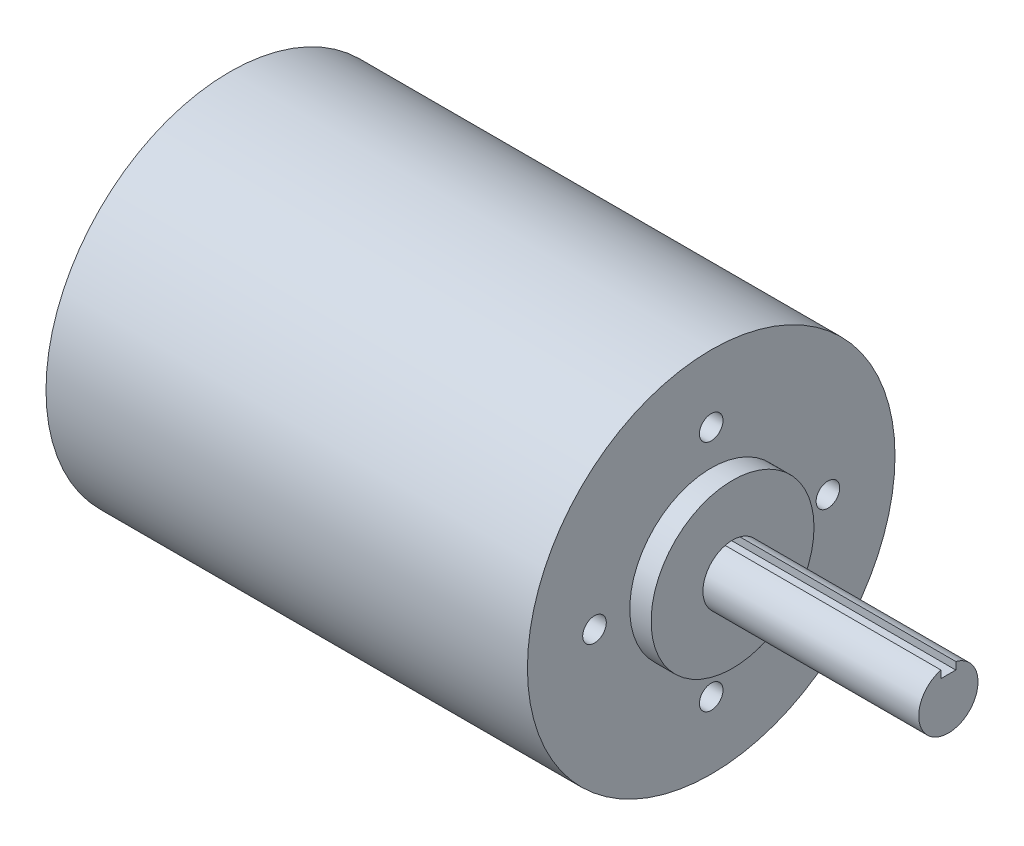
ISO-10303-21;
HEADER;
FILE_DESCRIPTION(('STEP AP214'),'2;1');
FILE_NAME('part.step','',(''),(''),'','','');
FILE_SCHEMA(('AUTOMOTIVE_DESIGN { 1 0 10303 214 1 1 1 1 }'));
ENDSEC;
DATA;
#1=APPLICATION_CONTEXT('core data for automotive mechanical design processes');
#2=APPLICATION_PROTOCOL_DEFINITION('international standard','automotive_design',2000,#1);
#3=PRODUCT_CONTEXT('',#1,'mechanical');
#4=PRODUCT('Part','Part','',(#3));
#5=PRODUCT_RELATED_PRODUCT_CATEGORY('part','',(#4));
#6=PRODUCT_DEFINITION_FORMATION('','',#4);
#7=PRODUCT_DEFINITION_CONTEXT('part definition',#1,'design');
#8=PRODUCT_DEFINITION('design','',#6,#7);
#9=PRODUCT_DEFINITION_SHAPE('','',#8);
#10=(LENGTH_UNIT() NAMED_UNIT(*) SI_UNIT(.MILLI.,.METRE.));
#11=(NAMED_UNIT(*) PLANE_ANGLE_UNIT() SI_UNIT($,.RADIAN.));
#12=(NAMED_UNIT(*) SI_UNIT($,.STERADIAN.) SOLID_ANGLE_UNIT());
#13=UNCERTAINTY_MEASURE_WITH_UNIT(LENGTH_MEASURE(1.E-05),#10,'distance_accuracy_value','');
#14=(GEOMETRIC_REPRESENTATION_CONTEXT(3) GLOBAL_UNCERTAINTY_ASSIGNED_CONTEXT((#13)) GLOBAL_UNIT_ASSIGNED_CONTEXT((#10,
#11,#12)) REPRESENTATION_CONTEXT('',''));
#15=CARTESIAN_POINT('',(0.,0.,0.));
#16=DIRECTION('',(0.,0.,1.));
#17=DIRECTION('',(1.,0.,0.));
#18=AXIS2_PLACEMENT_3D('',#15,#16,#17);
#19=CARTESIAN_POINT('',(103.124,0.,0.));
#20=DIRECTION('',(1.,0.,0.));
#21=DIRECTION('',(0.,0.,-1.));
#22=AXIS2_PLACEMENT_3D('',#19,#20,#21);
#23=PLANE('',#22);
#24=CARTESIAN_POINT('',(103.124,2.61861100413235E-13,25.));
#25=DIRECTION('',(1.,0.,0.));
#26=DIRECTION('',(0.,0.,-1.));
#27=AXIS2_PLACEMENT_3D('',#24,#25,#26);
#28=CIRCLE('',#27,2.5273);
#29=CARTESIAN_POINT('',(103.124,2.61861100413235E-13,22.4727));
#30=VERTEX_POINT('',#29);
#31=EDGE_CURVE('E335',#30,#30,#28,.T.);
#32=ORIENTED_EDGE('',*,*,#31,.F.);
#33=EDGE_LOOP('',(#32));
#34=FACE_BOUND('',#33,.T.);
#35=CARTESIAN_POINT('',(103.124,-25.,0.));
#36=DIRECTION('',(1.,0.,0.));
#37=DIRECTION('',(0.,0.,-1.));
#38=AXIS2_PLACEMENT_3D('',#35,#36,#37);
#39=CIRCLE('',#38,2.5273);
#40=CARTESIAN_POINT('',(103.124,-25.,-2.5273));
#41=VERTEX_POINT('',#40);
#42=EDGE_CURVE('E341',#41,#41,#39,.T.);
#43=ORIENTED_EDGE('',*,*,#42,.F.);
#44=EDGE_LOOP('',(#43));
#45=FACE_BOUND('',#44,.T.);
#46=CARTESIAN_POINT('',(103.124,0.,-25.));
#47=DIRECTION('',(1.,0.,0.));
#48=DIRECTION('',(0.,0.,-1.));
#49=AXIS2_PLACEMENT_3D('',#46,#47,#48);
#50=CIRCLE('',#49,2.5273);
#51=CARTESIAN_POINT('',(103.124,0.,-27.5273));
#52=VERTEX_POINT('',#51);
#53=EDGE_CURVE('E347',#52,#52,#50,.T.);
#54=ORIENTED_EDGE('',*,*,#53,.F.);
#55=EDGE_LOOP('',(#54));
#56=FACE_BOUND('',#55,.T.);
#57=CARTESIAN_POINT('',(103.124,25.,0.));
#58=DIRECTION('',(1.,0.,0.));
#59=DIRECTION('',(0.,0.,-1.));
#60=AXIS2_PLACEMENT_3D('',#57,#58,#59);
#61=CIRCLE('',#60,2.5273);
#62=CARTESIAN_POINT('',(103.124,25.,-2.5273));
#63=VERTEX_POINT('',#62);
#64=EDGE_CURVE('E353',#63,#63,#61,.T.);
#65=ORIENTED_EDGE('',*,*,#64,.F.);
#66=EDGE_LOOP('',(#65));
#67=FACE_BOUND('',#66,.T.);
#68=CARTESIAN_POINT('',(103.124,0.,0.));
#69=DIRECTION('',(1.,0.,0.));
#70=DIRECTION('',(0.,0.,-1.));
#71=AXIS2_PLACEMENT_3D('',#68,#69,#70);
#72=CIRCLE('',#71,39.37);
#73=CARTESIAN_POINT('',(103.124,0.,-39.37));
#74=VERTEX_POINT('',#73);
#75=EDGE_CURVE('E11',#74,#74,#72,.T.);
#76=ORIENTED_EDGE('',*,*,#75,.T.);
#77=EDGE_LOOP('',(#76));
#78=FACE_BOUND('',#77,.T.);
#79=CARTESIAN_POINT('',(103.124,0.,0.));
#80=DIRECTION('',(1.,0.,0.));
#81=DIRECTION('',(0.,0.,-1.));
#82=AXIS2_PLACEMENT_3D('',#79,#80,#81);
#83=CIRCLE('',#82,17.4498);
#84=CARTESIAN_POINT('',(103.124,0.,-17.4498));
#85=VERTEX_POINT('',#84);
#86=EDGE_CURVE('E327',#85,#85,#83,.T.);
#87=ORIENTED_EDGE('',*,*,#86,.F.);
#88=EDGE_LOOP('',(#87));
#89=FACE_BOUND('',#88,.T.);
#90=ADVANCED_FACE('F35',(#34,#45,#56,#67,#78,#89),#23,.T.);
#91=CARTESIAN_POINT('',(103.124,0.,0.));
#92=DIRECTION('',(-1.,0.,0.));
#93=DIRECTION('',(0.,0.,1.));
#94=AXIS2_PLACEMENT_3D('',#91,#92,#93);
#95=CYLINDRICAL_SURFACE('',#94,39.37);
#96=ORIENTED_EDGE('',*,*,#75,.F.);
#97=EDGE_LOOP('',(#96));
#98=FACE_BOUND('',#97,.T.);
#99=CARTESIAN_POINT('',(0.,0.,0.));
#100=DIRECTION('',(1.,0.,0.));
#101=DIRECTION('',(0.,0.,-1.));
#102=AXIS2_PLACEMENT_3D('',#99,#100,#101);
#103=CIRCLE('',#102,39.37);
#104=CARTESIAN_POINT('',(0.,0.,-39.37));
#105=VERTEX_POINT('',#104);
#106=EDGE_CURVE('E39',#105,#105,#103,.T.);
#107=ORIENTED_EDGE('',*,*,#106,.T.);
#108=EDGE_LOOP('',(#107));
#109=FACE_BOUND('',#108,.T.);
#110=ADVANCED_FACE('F37',(#98,#109),#95,.T.);
#111=CARTESIAN_POINT('',(0.,0.,0.));
#112=DIRECTION('',(1.,0.,0.));
#113=DIRECTION('',(0.,0.,-1.));
#114=AXIS2_PLACEMENT_3D('',#111,#112,#113);
#115=PLANE('',#114);
#116=ORIENTED_EDGE('',*,*,#106,.F.);
#117=EDGE_LOOP('',(#116));
#118=FACE_BOUND('',#117,.T.);
#119=ADVANCED_FACE('F135',(#118),#115,.F.);
#120=CARTESIAN_POINT('',(93.124,25.,0.));
#121=DIRECTION('',(1.,0.,0.));
#122=DIRECTION('',(0.,0.,-1.));
#123=AXIS2_PLACEMENT_3D('',#120,#121,#122);
#124=CONICAL_SURFACE('',#123,2.5273,1.02974425867665);
#125=CARTESIAN_POINT('',(91.6054449575316,25.,0.));
#126=VERTEX_POINT('',#125);
#127=VERTEX_LOOP('',#126);
#128=FACE_BOUND('',#127,.T.);
#129=CARTESIAN_POINT('',(93.124,25.,0.));
#130=DIRECTION('',(1.,0.,0.));
#131=DIRECTION('',(0.,0.,-1.));
#132=AXIS2_PLACEMENT_3D('',#129,#130,#131);
#133=CIRCLE('',#132,2.5273);
#134=CARTESIAN_POINT('',(93.124,25.,-2.5273));
#135=VERTEX_POINT('',#134);
#136=EDGE_CURVE('E356',#135,#135,#133,.T.);
#137=ORIENTED_EDGE('',*,*,#136,.T.);
#138=EDGE_LOOP('',(#137));
#139=FACE_BOUND('',#138,.T.);
#140=ADVANCED_FACE('F137',(#128,#139),#124,.F.);
#141=CARTESIAN_POINT('',(103.124,25.,0.));
#142=DIRECTION('',(1.,0.,0.));
#143=DIRECTION('',(0.,0.,-1.));
#144=AXIS2_PLACEMENT_3D('',#141,#142,#143);
#145=CYLINDRICAL_SURFACE('',#144,2.5273);
#146=ORIENTED_EDGE('',*,*,#136,.F.);
#147=EDGE_LOOP('',(#146));
#148=FACE_BOUND('',#147,.T.);
#149=ORIENTED_EDGE('',*,*,#64,.T.);
#150=EDGE_LOOP('',(#149));
#151=FACE_BOUND('',#150,.T.);
#152=ADVANCED_FACE('F142',(#148,#151),#145,.F.);
#153=CARTESIAN_POINT('',(93.124,0.,-25.));
#154=DIRECTION('',(1.,0.,0.));
#155=DIRECTION('',(0.,0.,-1.));
#156=AXIS2_PLACEMENT_3D('',#153,#154,#155);
#157=CONICAL_SURFACE('',#156,2.5273,1.02974425867665);
#158=CARTESIAN_POINT('',(91.6054449575316,0.,-25.));
#159=VERTEX_POINT('',#158);
#160=VERTEX_LOOP('',#159);
#161=FACE_BOUND('',#160,.T.);
#162=CARTESIAN_POINT('',(93.124,0.,-25.));
#163=DIRECTION('',(1.,0.,0.));
#164=DIRECTION('',(0.,0.,-1.));
#165=AXIS2_PLACEMENT_3D('',#162,#163,#164);
#166=CIRCLE('',#165,2.5273);
#167=CARTESIAN_POINT('',(93.124,0.,-27.5273));
#168=VERTEX_POINT('',#167);
#169=EDGE_CURVE('E350',#168,#168,#166,.T.);
#170=ORIENTED_EDGE('',*,*,#169,.T.);
#171=EDGE_LOOP('',(#170));
#172=FACE_BOUND('',#171,.T.);
#173=ADVANCED_FACE('F178',(#161,#172),#157,.F.);
#174=CARTESIAN_POINT('',(103.124,0.,-25.));
#175=DIRECTION('',(1.,0.,0.));
#176=DIRECTION('',(0.,0.,-1.));
#177=AXIS2_PLACEMENT_3D('',#174,#175,#176);
#178=CYLINDRICAL_SURFACE('',#177,2.5273);
#179=ORIENTED_EDGE('',*,*,#169,.F.);
#180=EDGE_LOOP('',(#179));
#181=FACE_BOUND('',#180,.T.);
#182=ORIENTED_EDGE('',*,*,#53,.T.);
#183=EDGE_LOOP('',(#182));
#184=FACE_BOUND('',#183,.T.);
#185=ADVANCED_FACE('F182',(#181,#184),#178,.F.);
#186=CARTESIAN_POINT('',(93.124,-25.,0.));
#187=DIRECTION('',(1.,0.,0.));
#188=DIRECTION('',(0.,0.,-1.));
#189=AXIS2_PLACEMENT_3D('',#186,#187,#188);
#190=CONICAL_SURFACE('',#189,2.5273,1.02974425867665);
#191=CARTESIAN_POINT('',(91.6054449575316,-25.,0.));
#192=VERTEX_POINT('',#191);
#193=VERTEX_LOOP('',#192);
#194=FACE_BOUND('',#193,.T.);
#195=CARTESIAN_POINT('',(93.124,-25.,0.));
#196=DIRECTION('',(1.,0.,0.));
#197=DIRECTION('',(0.,0.,-1.));
#198=AXIS2_PLACEMENT_3D('',#195,#196,#197);
#199=CIRCLE('',#198,2.5273);
#200=CARTESIAN_POINT('',(93.124,-25.,-2.5273));
#201=VERTEX_POINT('',#200);
#202=EDGE_CURVE('E344',#201,#201,#199,.T.);
#203=ORIENTED_EDGE('',*,*,#202,.T.);
#204=EDGE_LOOP('',(#203));
#205=FACE_BOUND('',#204,.T.);
#206=ADVANCED_FACE('F186',(#194,#205),#190,.F.);
#207=CARTESIAN_POINT('',(103.124,-25.,0.));
#208=DIRECTION('',(1.,0.,0.));
#209=DIRECTION('',(0.,0.,-1.));
#210=AXIS2_PLACEMENT_3D('',#207,#208,#209);
#211=CYLINDRICAL_SURFACE('',#210,2.5273);
#212=ORIENTED_EDGE('',*,*,#202,.F.);
#213=EDGE_LOOP('',(#212));
#214=FACE_BOUND('',#213,.T.);
#215=ORIENTED_EDGE('',*,*,#42,.T.);
#216=EDGE_LOOP('',(#215));
#217=FACE_BOUND('',#216,.T.);
#218=ADVANCED_FACE('F190',(#214,#217),#211,.F.);
#219=CARTESIAN_POINT('',(93.124,2.61861100413235E-13,25.));
#220=DIRECTION('',(1.,0.,0.));
#221=DIRECTION('',(0.,0.,-1.));
#222=AXIS2_PLACEMENT_3D('',#219,#220,#221);
#223=CONICAL_SURFACE('',#222,2.5273,1.02974425867665);
#224=CARTESIAN_POINT('',(91.6054449575316,2.5876526367141E-13,25.));
#225=VERTEX_POINT('',#224);
#226=VERTEX_LOOP('',#225);
#227=FACE_BOUND('',#226,.T.);
#228=CARTESIAN_POINT('',(93.124,2.61861100413235E-13,25.));
#229=DIRECTION('',(1.,0.,0.));
#230=DIRECTION('',(0.,0.,-1.));
#231=AXIS2_PLACEMENT_3D('',#228,#229,#230);
#232=CIRCLE('',#231,2.5273);
#233=CARTESIAN_POINT('',(93.124,2.61861100413235E-13,22.4727));
#234=VERTEX_POINT('',#233);
#235=EDGE_CURVE('E338',#234,#234,#232,.T.);
#236=ORIENTED_EDGE('',*,*,#235,.T.);
#237=EDGE_LOOP('',(#236));
#238=FACE_BOUND('',#237,.T.);
#239=ADVANCED_FACE('F194',(#227,#238),#223,.F.);
#240=CARTESIAN_POINT('',(103.124,2.61861100413235E-13,25.));
#241=DIRECTION('',(1.,0.,0.));
#242=DIRECTION('',(0.,0.,-1.));
#243=AXIS2_PLACEMENT_3D('',#240,#241,#242);
#244=CYLINDRICAL_SURFACE('',#243,2.5273);
#245=ORIENTED_EDGE('',*,*,#235,.F.);
#246=EDGE_LOOP('',(#245));
#247=FACE_BOUND('',#246,.T.);
#248=ORIENTED_EDGE('',*,*,#31,.T.);
#249=EDGE_LOOP('',(#248));
#250=FACE_BOUND('',#249,.T.);
#251=ADVANCED_FACE('F198',(#247,#250),#244,.F.);
#252=CARTESIAN_POINT('',(107.696,0.,0.));
#253=DIRECTION('',(-1.,0.,0.));
#254=DIRECTION('',(0.,0.,1.));
#255=AXIS2_PLACEMENT_3D('',#252,#253,#254);
#256=CYLINDRICAL_SURFACE('',#255,6.35);
#257=DIRECTION('',(-1.,0.,0.));
#258=VECTOR('',#257,1.);
#259=CARTESIAN_POINT('',(107.696,6.14836106210427,-1.5875));
#260=LINE('',#259,#258);
#261=CARTESIAN_POINT('',(107.696,6.14836106210427,-1.5875));
#262=VERTEX_POINT('',#261);
#263=CARTESIAN_POINT('',(103.124,6.14836106210427,-1.5875));
#264=VERTEX_POINT('',#263);
#265=EDGE_CURVE('E332',#262,#264,#260,.T.);
#266=ORIENTED_EDGE('',*,*,#265,.F.);
#267=CARTESIAN_POINT('',(107.696,0.,0.));
#268=DIRECTION('',(1.,0.,0.));
#269=DIRECTION('',(0.,0.,-1.));
#270=AXIS2_PLACEMENT_3D('',#267,#268,#269);
#271=CIRCLE('',#270,6.35);
#272=CARTESIAN_POINT('',(107.696,6.14836106210427,1.5875));
#273=VERTEX_POINT('',#272);
#274=EDGE_CURVE('E117',#262,#273,#271,.T.);
#275=ORIENTED_EDGE('',*,*,#274,.T.);
#276=DIRECTION('',(-1.,0.,0.));
#277=VECTOR('',#276,1.);
#278=CARTESIAN_POINT('',(153.924,6.14836106210427,1.5875));
#279=LINE('',#278,#277);
#280=CARTESIAN_POINT('',(103.124,6.14836106210427,1.5875));
#281=VERTEX_POINT('',#280);
#282=EDGE_CURVE('E58',#273,#281,#279,.T.);
#283=ORIENTED_EDGE('',*,*,#282,.T.);
#284=CARTESIAN_POINT('',(103.124,0.,0.));
#285=DIRECTION('',(1.,0.,0.));
#286=DIRECTION('',(0.,0.,-1.));
#287=AXIS2_PLACEMENT_3D('',#284,#285,#286);
#288=CIRCLE('',#287,6.35);
#289=EDGE_CURVE('E108',#264,#281,#288,.T.);
#290=ORIENTED_EDGE('',*,*,#289,.F.);
#291=EDGE_LOOP('',(#266,#275,#283,#290));
#292=FACE_BOUND('',#291,.T.);
#293=ADVANCED_FACE('F115',(#292),#256,.F.);
#294=CARTESIAN_POINT('',(107.696,0.,0.));
#295=DIRECTION('',(1.,0.,0.));
#296=DIRECTION('',(0.,0.,-1.));
#297=AXIS2_PLACEMENT_3D('',#294,#295,#296);
#298=PLANE('',#297);
#299=CARTESIAN_POINT('',(107.696,0.,0.));
#300=DIRECTION('',(1.,0.,0.));
#301=DIRECTION('',(0.,0.,-1.));
#302=AXIS2_PLACEMENT_3D('',#299,#300,#301);
#303=CIRCLE('',#302,17.4498);
#304=CARTESIAN_POINT('',(107.696,0.,-17.4498));
#305=VERTEX_POINT('',#304);
#306=EDGE_CURVE('E326',#305,#305,#303,.T.);
#307=ORIENTED_EDGE('',*,*,#306,.T.);
#308=EDGE_LOOP('',(#307));
#309=FACE_BOUND('',#308,.T.);
#310=ORIENTED_EDGE('',*,*,#274,.F.);
#311=EDGE_CURVE('E50',#273,#262,#271,.T.);
#312=ORIENTED_EDGE('',*,*,#311,.F.);
#313=EDGE_LOOP('',(#310,#312));
#314=FACE_BOUND('',#313,.T.);
#315=ADVANCED_FACE('F205',(#309,#314),#298,.T.);
#316=CARTESIAN_POINT('',(107.696,0.,0.));
#317=DIRECTION('',(-1.,0.,0.));
#318=DIRECTION('',(0.,0.,1.));
#319=AXIS2_PLACEMENT_3D('',#316,#317,#318);
#320=CYLINDRICAL_SURFACE('',#319,17.4498);
#321=ORIENTED_EDGE('',*,*,#306,.F.);
#322=EDGE_LOOP('',(#321));
#323=FACE_BOUND('',#322,.T.);
#324=ORIENTED_EDGE('',*,*,#86,.T.);
#325=EDGE_LOOP('',(#324));
#326=FACE_BOUND('',#325,.T.);
#327=ADVANCED_FACE('F170',(#323,#326),#320,.T.);
#328=CARTESIAN_POINT('',(153.924,4.56086106210427,1.5875));
#329=DIRECTION('',(0.,-1.,0.));
#330=DIRECTION('',(0.,0.,-1.));
#331=AXIS2_PLACEMENT_3D('',#328,#329,#330);
#332=PLANE('',#331);
#333=DIRECTION('',(0.,0.,1.));
#334=VECTOR('',#333,1.);
#335=CARTESIAN_POINT('',(103.124,4.56086106210427,1.5875));
#336=LINE('',#335,#334);
#337=CARTESIAN_POINT('',(103.124,4.56086106210427,-1.5875));
#338=VERTEX_POINT('',#337);
#339=CARTESIAN_POINT('',(103.124,4.56086106210427,1.5875));
#340=VERTEX_POINT('',#339);
#341=EDGE_CURVE('E104',#338,#340,#336,.T.);
#342=ORIENTED_EDGE('',*,*,#341,.T.);
#343=DIRECTION('',(-1.,0.,0.));
#344=VECTOR('',#343,1.);
#345=CARTESIAN_POINT('',(153.924,4.56086106210427,1.5875));
#346=LINE('',#345,#344);
#347=CARTESIAN_POINT('',(153.924,4.56086106210427,1.5875));
#348=VERTEX_POINT('',#347);
#349=EDGE_CURVE('E99',#348,#340,#346,.T.);
#350=ORIENTED_EDGE('',*,*,#349,.F.);
#351=DIRECTION('',(0.,0.,1.));
#352=VECTOR('',#351,1.);
#353=CARTESIAN_POINT('',(153.924,4.56086106210427,1.5875));
#354=LINE('',#353,#352);
#355=CARTESIAN_POINT('',(153.924,4.56086106210427,-1.5875));
#356=VERTEX_POINT('',#355);
#357=EDGE_CURVE('E121',#356,#348,#354,.T.);
#358=ORIENTED_EDGE('',*,*,#357,.F.);
#359=DIRECTION('',(-1.,0.,0.));
#360=VECTOR('',#359,1.);
#361=CARTESIAN_POINT('',(153.924,4.56086106210427,-1.5875));
#362=LINE('',#361,#360);
#363=EDGE_CURVE('E126',#356,#338,#362,.T.);
#364=ORIENTED_EDGE('',*,*,#363,.T.);
#365=EDGE_LOOP('',(#342,#350,#358,#364));
#366=FACE_BOUND('',#365,.T.);
#367=ADVANCED_FACE('F168',(#366),#332,.F.);
#368=CARTESIAN_POINT('',(153.924,0.,0.));
#369=DIRECTION('',(1.,0.,0.));
#370=DIRECTION('',(0.,0.,-1.));
#371=AXIS2_PLACEMENT_3D('',#368,#369,#370);
#372=PLANE('',#371);
#373=CARTESIAN_POINT('',(153.924,0.,0.));
#374=DIRECTION('',(1.,0.,0.));
#375=DIRECTION('',(0.,0.,-1.));
#376=AXIS2_PLACEMENT_3D('',#373,#374,#375);
#377=CIRCLE('',#376,6.35);
#378=CARTESIAN_POINT('',(153.924,6.14836106210427,1.5875));
#379=VERTEX_POINT('',#378);
#380=CARTESIAN_POINT('',(153.924,6.14836106210427,-1.5875));
#381=VERTEX_POINT('',#380);
#382=EDGE_CURVE('E103',#379,#381,#377,.T.);
#383=ORIENTED_EDGE('',*,*,#382,.T.);
#384=DIRECTION('',(0.,-1.,0.));
#385=VECTOR('',#384,1.);
#386=CARTESIAN_POINT('',(153.924,6.14836106210427,-1.5875));
#387=LINE('',#386,#385);
#388=EDGE_CURVE('E361',#381,#356,#387,.T.);
#389=ORIENTED_EDGE('',*,*,#388,.T.);
#390=ORIENTED_EDGE('',*,*,#357,.T.);
#391=DIRECTION('',(0.,1.,0.));
#392=VECTOR('',#391,1.);
#393=CARTESIAN_POINT('',(153.924,6.14836106210427,1.5875));
#394=LINE('',#393,#392);
#395=EDGE_CURVE('E119',#348,#379,#394,.T.);
#396=ORIENTED_EDGE('',*,*,#395,.T.);
#397=EDGE_LOOP('',(#383,#389,#390,#396));
#398=FACE_BOUND('',#397,.T.);
#399=ADVANCED_FACE('F167',(#398),#372,.T.);
#400=CARTESIAN_POINT('',(153.924,6.14836106210427,-1.5875));
#401=DIRECTION('',(0.,0.,-1.));
#402=DIRECTION('',(0.,1.,0.));
#403=AXIS2_PLACEMENT_3D('',#400,#401,#402);
#404=PLANE('',#403);
#405=DIRECTION('',(0.,-1.,0.));
#406=VECTOR('',#405,1.);
#407=CARTESIAN_POINT('',(103.124,6.14836106210427,-1.5875));
#408=LINE('',#407,#406);
#409=EDGE_CURVE('E110',#264,#338,#408,.T.);
#410=ORIENTED_EDGE('',*,*,#409,.T.);
#411=ORIENTED_EDGE('',*,*,#363,.F.);
#412=ORIENTED_EDGE('',*,*,#388,.F.);
#413=DIRECTION('',(-1.,0.,0.));
#414=VECTOR('',#413,1.);
#415=CARTESIAN_POINT('',(153.924,6.14836106210427,-1.5875));
#416=LINE('',#415,#414);
#417=EDGE_CURVE('E129',#381,#262,#416,.T.);
#418=ORIENTED_EDGE('',*,*,#417,.T.);
#419=ORIENTED_EDGE('',*,*,#265,.T.);
#420=EDGE_LOOP('',(#410,#411,#412,#418,#419));
#421=FACE_BOUND('',#420,.T.);
#422=ADVANCED_FACE('F162',(#421),#404,.F.);
#423=CARTESIAN_POINT('',(153.924,6.14836106210427,1.5875));
#424=DIRECTION('',(0.,0.,1.));
#425=DIRECTION('',(1.,0.,0.));
#426=AXIS2_PLACEMENT_3D('',#423,#424,#425);
#427=PLANE('',#426);
#428=DIRECTION('',(0.,1.,0.));
#429=VECTOR('',#428,1.);
#430=CARTESIAN_POINT('',(103.124,6.14836106210427,1.5875));
#431=LINE('',#430,#429);
#432=EDGE_CURVE('E94',#340,#281,#431,.T.);
#433=ORIENTED_EDGE('',*,*,#432,.T.);
#434=ORIENTED_EDGE('',*,*,#282,.F.);
#435=EDGE_CURVE('E118',#379,#273,#279,.T.);
#436=ORIENTED_EDGE('',*,*,#435,.F.);
#437=ORIENTED_EDGE('',*,*,#395,.F.);
#438=ORIENTED_EDGE('',*,*,#349,.T.);
#439=EDGE_LOOP('',(#433,#434,#436,#437,#438));
#440=FACE_BOUND('',#439,.T.);
#441=ADVANCED_FACE('F96',(#440),#427,.F.);
#442=CARTESIAN_POINT('',(153.924,0.,0.));
#443=DIRECTION('',(-1.,0.,0.));
#444=DIRECTION('',(0.,0.,1.));
#445=AXIS2_PLACEMENT_3D('',#442,#443,#444);
#446=CYLINDRICAL_SURFACE('',#445,6.35);
#447=ORIENTED_EDGE('',*,*,#435,.T.);
#448=ORIENTED_EDGE('',*,*,#311,.T.);
#449=ORIENTED_EDGE('',*,*,#417,.F.);
#450=ORIENTED_EDGE('',*,*,#382,.F.);
#451=EDGE_LOOP('',(#447,#448,#449,#450));
#452=FACE_BOUND('',#451,.T.);
#453=ADVANCED_FACE('F155',(#452),#446,.T.);
#454=ORIENTED_EDGE('',*,*,#289,.T.);
#455=ORIENTED_EDGE('',*,*,#432,.F.);
#456=ORIENTED_EDGE('',*,*,#341,.F.);
#457=ORIENTED_EDGE('',*,*,#409,.F.);
#458=EDGE_LOOP('',(#454,#455,#456,#457));
#459=FACE_BOUND('',#458,.T.);
#460=ADVANCED_FACE('F109',(#459),#23,.T.);
#461=CLOSED_SHELL('',(#90,#110,#119,#140,#152,#173,#185,#206,#218,#239,#251,#293,#315,#327,#367,
#399,#422,#441,#453,#460));
#462=MANIFOLD_SOLID_BREP('B2',#461);
#463=ADVANCED_BREP_SHAPE_REPRESENTATION('',(#18,#462),#14);
#464=SHAPE_DEFINITION_REPRESENTATION(#9,#463);
ENDSEC;
END-ISO-10303-21;
